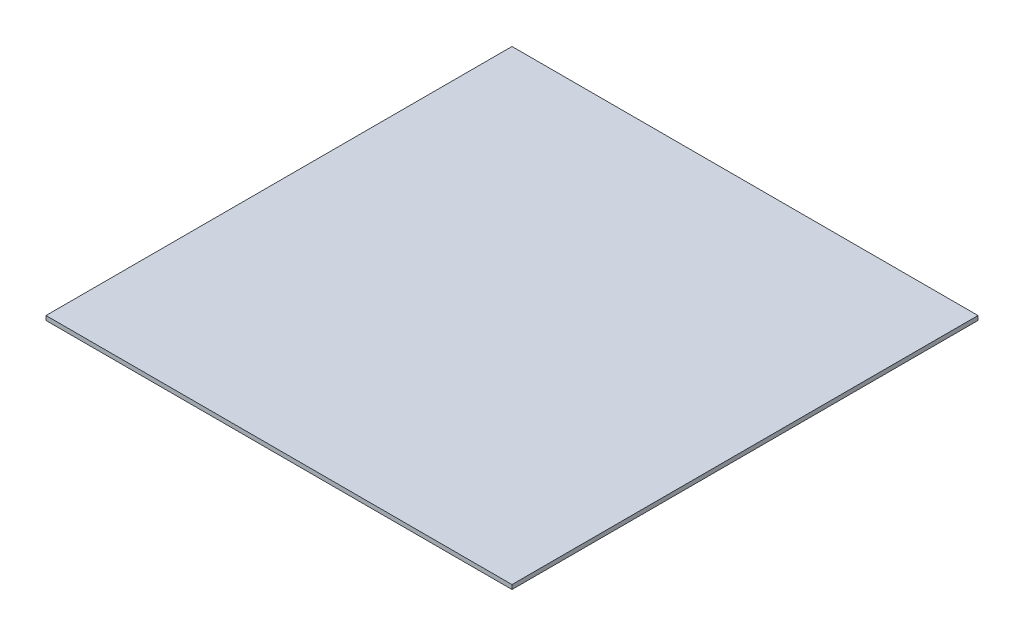
ISO-10303-21;
HEADER;
FILE_DESCRIPTION(('STEP AP214'),'2;1');
FILE_NAME('part.step','',(''),(''),'','','');
FILE_SCHEMA(('AUTOMOTIVE_DESIGN { 1 0 10303 214 1 1 1 1 }'));
ENDSEC;
DATA;
#1=APPLICATION_CONTEXT('core data for automotive mechanical design processes');
#2=APPLICATION_PROTOCOL_DEFINITION('international standard','automotive_design',2000,#1);
#3=PRODUCT_CONTEXT('',#1,'mechanical');
#4=PRODUCT('Part','Part','',(#3));
#5=PRODUCT_RELATED_PRODUCT_CATEGORY('part','',(#4));
#6=PRODUCT_DEFINITION_FORMATION('','',#4);
#7=PRODUCT_DEFINITION_CONTEXT('part definition',#1,'design');
#8=PRODUCT_DEFINITION('design','',#6,#7);
#9=PRODUCT_DEFINITION_SHAPE('','',#8);
#10=(LENGTH_UNIT() NAMED_UNIT(*) SI_UNIT(.MILLI.,.METRE.));
#11=(NAMED_UNIT(*) PLANE_ANGLE_UNIT() SI_UNIT($,.RADIAN.));
#12=(NAMED_UNIT(*) SI_UNIT($,.STERADIAN.) SOLID_ANGLE_UNIT());
#13=UNCERTAINTY_MEASURE_WITH_UNIT(LENGTH_MEASURE(1.E-05),#10,'distance_accuracy_value','');
#14=(GEOMETRIC_REPRESENTATION_CONTEXT(3) GLOBAL_UNCERTAINTY_ASSIGNED_CONTEXT((#13)) GLOBAL_UNIT_ASSIGNED_CONTEXT((#10,
#11,#12)) REPRESENTATION_CONTEXT('',''));
#15=CARTESIAN_POINT('',(0.,0.,0.));
#16=DIRECTION('',(0.,0.,1.));
#17=DIRECTION('',(1.,0.,0.));
#18=AXIS2_PLACEMENT_3D('',#15,#16,#17);
#19=CARTESIAN_POINT('',(0.,6.35,0.));
#20=DIRECTION('',(-1.,0.,0.));
#21=DIRECTION('',(0.,0.,1.));
#22=AXIS2_PLACEMENT_3D('',#19,#20,#21);
#23=PLANE('',#22);
#24=DIRECTION('',(0.,0.,-1.));
#25=VECTOR('',#24,1.);
#26=CARTESIAN_POINT('',(0.,0.,0.));
#27=LINE('',#26,#25);
#28=CARTESIAN_POINT('',(0.,0.,0.));
#29=VERTEX_POINT('',#28);
#30=CARTESIAN_POINT('',(0.,0.,-685.8));
#31=VERTEX_POINT('',#30);
#32=EDGE_CURVE('E98',#29,#31,#27,.T.);
#33=ORIENTED_EDGE('',*,*,#32,.T.);
#34=DIRECTION('',(0.,-1.,0.));
#35=VECTOR('',#34,1.);
#36=CARTESIAN_POINT('',(0.,6.35,-685.8));
#37=LINE('',#36,#35);
#38=CARTESIAN_POINT('',(0.,6.35,-685.8));
#39=VERTEX_POINT('',#38);
#40=EDGE_CURVE('E11',#39,#31,#37,.T.);
#41=ORIENTED_EDGE('',*,*,#40,.F.);
#42=DIRECTION('',(0.,0.,-1.));
#43=VECTOR('',#42,1.);
#44=CARTESIAN_POINT('',(0.,6.35,0.));
#45=LINE('',#44,#43);
#46=CARTESIAN_POINT('',(0.,6.35,0.));
#47=VERTEX_POINT('',#46);
#48=EDGE_CURVE('E86',#47,#39,#45,.T.);
#49=ORIENTED_EDGE('',*,*,#48,.F.);
#50=DIRECTION('',(0.,-1.,0.));
#51=VECTOR('',#50,1.);
#52=CARTESIAN_POINT('',(0.,6.35,0.));
#53=LINE('',#52,#51);
#54=EDGE_CURVE('E94',#47,#29,#53,.T.);
#55=ORIENTED_EDGE('',*,*,#54,.T.);
#56=EDGE_LOOP('',(#33,#41,#49,#55));
#57=FACE_BOUND('',#56,.T.);
#58=ADVANCED_FACE('F35',(#57),#23,.F.);
#59=CARTESIAN_POINT('',(0.,6.35,-685.8));
#60=DIRECTION('',(0.,0.,1.));
#61=DIRECTION('',(1.,0.,0.));
#62=AXIS2_PLACEMENT_3D('',#59,#60,#61);
#63=PLANE('',#62);
#64=DIRECTION('',(-1.,0.,0.));
#65=VECTOR('',#64,1.);
#66=CARTESIAN_POINT('',(0.,0.,-685.8));
#67=LINE('',#66,#65);
#68=CARTESIAN_POINT('',(-685.8,0.,-685.8));
#69=VERTEX_POINT('',#68);
#70=EDGE_CURVE('E90',#31,#69,#67,.T.);
#71=ORIENTED_EDGE('',*,*,#70,.T.);
#72=DIRECTION('',(0.,-1.,0.));
#73=VECTOR('',#72,1.);
#74=CARTESIAN_POINT('',(-685.8,6.35,-685.8));
#75=LINE('',#74,#73);
#76=CARTESIAN_POINT('',(-685.8,6.35,-685.8));
#77=VERTEX_POINT('',#76);
#78=EDGE_CURVE('E43',#77,#69,#75,.T.);
#79=ORIENTED_EDGE('',*,*,#78,.F.);
#80=DIRECTION('',(-1.,0.,0.));
#81=VECTOR('',#80,1.);
#82=CARTESIAN_POINT('',(0.,6.35,-685.8));
#83=LINE('',#82,#81);
#84=EDGE_CURVE('E81',#39,#77,#83,.T.);
#85=ORIENTED_EDGE('',*,*,#84,.F.);
#86=ORIENTED_EDGE('',*,*,#40,.T.);
#87=EDGE_LOOP('',(#71,#79,#85,#86));
#88=FACE_BOUND('',#87,.T.);
#89=ADVANCED_FACE('F89',(#88),#63,.F.);
#90=CARTESIAN_POINT('',(-685.8,6.35,1.1843337560503E-13));
#91=DIRECTION('',(1.,0.,0.));
#92=DIRECTION('',(0.,0.,-1.));
#93=AXIS2_PLACEMENT_3D('',#90,#91,#92);
#94=PLANE('',#93);
#95=DIRECTION('',(0.,0.,1.));
#96=VECTOR('',#95,1.);
#97=CARTESIAN_POINT('',(-685.8,0.,1.1843337560503E-13));
#98=LINE('',#97,#96);
#99=CARTESIAN_POINT('',(-685.8,0.,1.1843337560503E-13));
#100=VERTEX_POINT('',#99);
#101=EDGE_CURVE('E68',#69,#100,#98,.T.);
#102=ORIENTED_EDGE('',*,*,#101,.T.);
#103=DIRECTION('',(0.,-1.,0.));
#104=VECTOR('',#103,1.);
#105=CARTESIAN_POINT('',(-685.8,6.35,1.1843337560503E-13));
#106=LINE('',#105,#104);
#107=CARTESIAN_POINT('',(-685.8,6.35,1.1843337560503E-13));
#108=VERTEX_POINT('',#107);
#109=EDGE_CURVE('E91',#108,#100,#106,.T.);
#110=ORIENTED_EDGE('',*,*,#109,.F.);
#111=DIRECTION('',(0.,0.,1.));
#112=VECTOR('',#111,1.);
#113=CARTESIAN_POINT('',(-685.8,6.35,1.1843337560503E-13));
#114=LINE('',#113,#112);
#115=EDGE_CURVE('E84',#77,#108,#114,.T.);
#116=ORIENTED_EDGE('',*,*,#115,.F.);
#117=ORIENTED_EDGE('',*,*,#78,.T.);
#118=EDGE_LOOP('',(#102,#110,#116,#117));
#119=FACE_BOUND('',#118,.T.);
#120=ADVANCED_FACE('F92',(#119),#94,.F.);
#121=CARTESIAN_POINT('',(0.,6.35,0.));
#122=DIRECTION('',(0.,0.,-1.));
#123=DIRECTION('',(-1.,0.,0.));
#124=AXIS2_PLACEMENT_3D('',#121,#122,#123);
#125=PLANE('',#124);
#126=DIRECTION('',(1.,0.,0.));
#127=VECTOR('',#126,1.);
#128=CARTESIAN_POINT('',(0.,0.,0.));
#129=LINE('',#128,#127);
#130=EDGE_CURVE('E74',#100,#29,#129,.T.);
#131=ORIENTED_EDGE('',*,*,#130,.T.);
#132=ORIENTED_EDGE('',*,*,#54,.F.);
#133=DIRECTION('',(1.,0.,0.));
#134=VECTOR('',#133,1.);
#135=CARTESIAN_POINT('',(0.,6.35,0.));
#136=LINE('',#135,#134);
#137=EDGE_CURVE('E51',#108,#47,#136,.T.);
#138=ORIENTED_EDGE('',*,*,#137,.F.);
#139=ORIENTED_EDGE('',*,*,#109,.T.);
#140=EDGE_LOOP('',(#131,#132,#138,#139));
#141=FACE_BOUND('',#140,.T.);
#142=ADVANCED_FACE('F105',(#141),#125,.F.);
#143=CARTESIAN_POINT('',(0.,6.35,0.));
#144=DIRECTION('',(0.,1.,0.));
#145=DIRECTION('',(0.,0.,1.));
#146=AXIS2_PLACEMENT_3D('',#143,#144,#145);
#147=PLANE('',#146);
#148=ORIENTED_EDGE('',*,*,#48,.T.);
#149=ORIENTED_EDGE('',*,*,#84,.T.);
#150=ORIENTED_EDGE('',*,*,#115,.T.);
#151=ORIENTED_EDGE('',*,*,#137,.T.);
#152=EDGE_LOOP('',(#148,#149,#150,#151));
#153=FACE_BOUND('',#152,.T.);
#154=ADVANCED_FACE('F82',(#153),#147,.T.);
#155=CARTESIAN_POINT('',(0.,0.,0.));
#156=DIRECTION('',(0.,1.,0.));
#157=DIRECTION('',(0.,0.,1.));
#158=AXIS2_PLACEMENT_3D('',#155,#156,#157);
#159=PLANE('',#158);
#160=ORIENTED_EDGE('',*,*,#32,.F.);
#161=ORIENTED_EDGE('',*,*,#130,.F.);
#162=ORIENTED_EDGE('',*,*,#101,.F.);
#163=ORIENTED_EDGE('',*,*,#70,.F.);
#164=EDGE_LOOP('',(#160,#161,#162,#163));
#165=FACE_BOUND('',#164,.T.);
#166=ADVANCED_FACE('F108',(#165),#159,.F.);
#167=CLOSED_SHELL('',(#58,#89,#120,#142,#154,#166));
#168=MANIFOLD_SOLID_BREP('B2',#167);
#169=ADVANCED_BREP_SHAPE_REPRESENTATION('',(#18,#168),#14);
#170=SHAPE_DEFINITION_REPRESENTATION(#9,#169);
ENDSEC;
END-ISO-10303-21;
